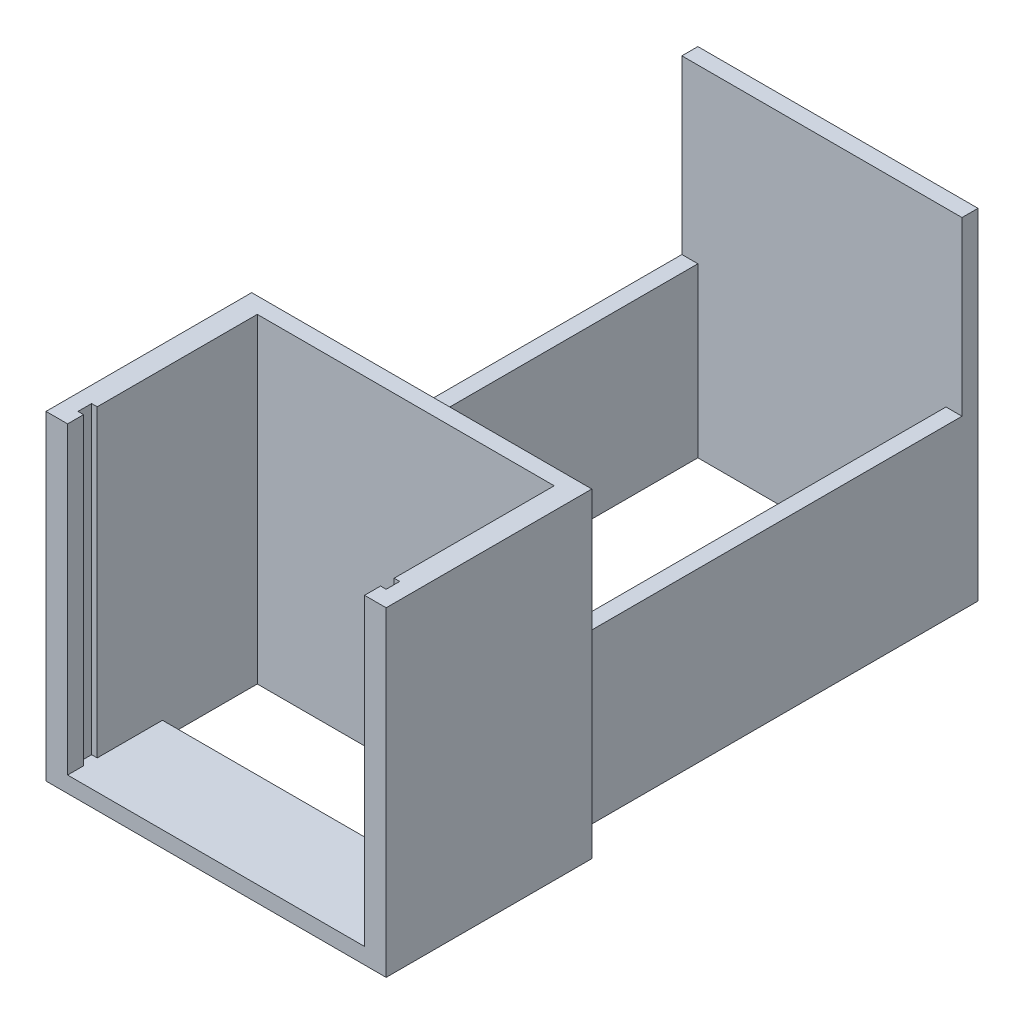
ISO-10303-21;
HEADER;
FILE_DESCRIPTION(('STEP AP214'),'2;1');
FILE_NAME('part.step','',(''),(''),'','','');
FILE_SCHEMA(('AUTOMOTIVE_DESIGN { 1 0 10303 214 1 1 1 1 }'));
ENDSEC;
DATA;
#1=APPLICATION_CONTEXT('core data for automotive mechanical design processes');
#2=APPLICATION_PROTOCOL_DEFINITION('international standard','automotive_design',2000,#1);
#3=PRODUCT_CONTEXT('',#1,'mechanical');
#4=PRODUCT('Part','Part','',(#3));
#5=PRODUCT_RELATED_PRODUCT_CATEGORY('part','',(#4));
#6=PRODUCT_DEFINITION_FORMATION('','',#4);
#7=PRODUCT_DEFINITION_CONTEXT('part definition',#1,'design');
#8=PRODUCT_DEFINITION('design','',#6,#7);
#9=PRODUCT_DEFINITION_SHAPE('','',#8);
#10=(LENGTH_UNIT() NAMED_UNIT(*) SI_UNIT(.MILLI.,.METRE.));
#11=(NAMED_UNIT(*) PLANE_ANGLE_UNIT() SI_UNIT($,.RADIAN.));
#12=(NAMED_UNIT(*) SI_UNIT($,.STERADIAN.) SOLID_ANGLE_UNIT());
#13=UNCERTAINTY_MEASURE_WITH_UNIT(LENGTH_MEASURE(1.E-05),#10,'distance_accuracy_value','');
#14=(GEOMETRIC_REPRESENTATION_CONTEXT(3) GLOBAL_UNCERTAINTY_ASSIGNED_CONTEXT((#13)) GLOBAL_UNIT_ASSIGNED_CONTEXT((#10,
#11,#12)) REPRESENTATION_CONTEXT('',''));
#15=CARTESIAN_POINT('',(0.,0.,0.));
#16=DIRECTION('',(0.,0.,1.));
#17=DIRECTION('',(1.,0.,0.));
#18=AXIS2_PLACEMENT_3D('',#15,#16,#17);
#19=CARTESIAN_POINT('',(0.,0.,2.39346473029046));
#20=DIRECTION('',(0.,0.,-1.));
#21=DIRECTION('',(-1.,0.,0.));
#22=AXIS2_PLACEMENT_3D('',#19,#20,#21);
#23=PLANE('',#22);
#24=DIRECTION('',(0.,-1.,0.));
#25=VECTOR('',#24,1.);
#26=CARTESIAN_POINT('',(-61.1489834024897,0.,2.39346473029046));
#27=LINE('',#26,#25);
#28=CARTESIAN_POINT('',(-61.1489834024897,19.,2.39346473029046));
#29=VERTEX_POINT('',#28);
#30=CARTESIAN_POINT('',(-61.1489834024897,-2.,2.39346473029046));
#31=VERTEX_POINT('',#30);
#32=EDGE_CURVE('E259',#29,#31,#27,.T.);
#33=ORIENTED_EDGE('',*,*,#32,.T.);
#34=DIRECTION('',(-1.,0.,0.));
#35=VECTOR('',#34,1.);
#36=CARTESIAN_POINT('',(-22.3989834024897,-2.,2.39346473029046));
#37=LINE('',#36,#35);
#38=CARTESIAN_POINT('',(-64.8989834024897,-2.,2.39346473029046));
#39=VERTEX_POINT('',#38);
#40=EDGE_CURVE('E327',#31,#39,#37,.T.);
#41=ORIENTED_EDGE('',*,*,#40,.T.);
#42=DIRECTION('',(0.,1.,0.));
#43=VECTOR('',#42,1.);
#44=CARTESIAN_POINT('',(-64.8989834024897,38.,2.39346473029046));
#45=LINE('',#44,#43);
#46=CARTESIAN_POINT('',(-64.8989834024897,38.,2.39346473029046));
#47=VERTEX_POINT('',#46);
#48=EDGE_CURVE('E331',#39,#47,#45,.T.);
#49=ORIENTED_EDGE('',*,*,#48,.T.);
#50=DIRECTION('',(1.,0.,0.));
#51=VECTOR('',#50,1.);
#52=CARTESIAN_POINT('',(-22.3989834024897,38.,2.39346473029046));
#53=LINE('',#52,#51);
#54=CARTESIAN_POINT('',(-22.3989834024897,38.,2.39346473029046));
#55=VERTEX_POINT('',#54);
#56=EDGE_CURVE('E335',#47,#55,#53,.T.);
#57=ORIENTED_EDGE('',*,*,#56,.T.);
#58=DIRECTION('',(0.,-1.,0.));
#59=VECTOR('',#58,1.);
#60=CARTESIAN_POINT('',(-22.3989834024897,38.,2.39346473029046));
#61=LINE('',#60,#59);
#62=CARTESIAN_POINT('',(-22.3989834024897,-2.,2.39346473029046));
#63=VERTEX_POINT('',#62);
#64=EDGE_CURVE('E324',#55,#63,#61,.T.);
#65=ORIENTED_EDGE('',*,*,#64,.T.);
#66=CARTESIAN_POINT('',(-26.1489834024897,-2.,2.39346473029046));
#67=VERTEX_POINT('',#66);
#68=EDGE_CURVE('E328',#63,#67,#37,.T.);
#69=ORIENTED_EDGE('',*,*,#68,.T.);
#70=DIRECTION('',(0.,-1.,0.));
#71=VECTOR('',#70,1.);
#72=CARTESIAN_POINT('',(-26.1489834024897,0.,2.39346473029046));
#73=LINE('',#72,#71);
#74=CARTESIAN_POINT('',(-26.1489834024897,19.,2.39346473029046));
#75=VERTEX_POINT('',#74);
#76=EDGE_CURVE('E286',#75,#67,#73,.T.);
#77=ORIENTED_EDGE('',*,*,#76,.F.);
#78=DIRECTION('',(-1.,0.,0.));
#79=VECTOR('',#78,1.);
#80=CARTESIAN_POINT('',(0.,19.,2.39346473029046));
#81=LINE('',#80,#79);
#82=CARTESIAN_POINT('',(-28.1489834024897,19.,2.39346473029046));
#83=VERTEX_POINT('',#82);
#84=EDGE_CURVE('E291',#75,#83,#81,.T.);
#85=ORIENTED_EDGE('',*,*,#84,.T.);
#86=DIRECTION('',(0.,-1.,0.));
#87=VECTOR('',#86,1.);
#88=CARTESIAN_POINT('',(-28.1489834024897,0.,2.39346473029046));
#89=LINE('',#88,#87);
#90=CARTESIAN_POINT('',(-28.1489834024897,-2.,2.39346473029046));
#91=VERTEX_POINT('',#90);
#92=EDGE_CURVE('E283',#83,#91,#89,.T.);
#93=ORIENTED_EDGE('',*,*,#92,.T.);
#94=CARTESIAN_POINT('',(-59.1489834024897,-2.,2.39346473029046));
#95=VERTEX_POINT('',#94);
#96=EDGE_CURVE('E332',#91,#95,#37,.T.);
#97=ORIENTED_EDGE('',*,*,#96,.T.);
#98=DIRECTION('',(0.,-1.,0.));
#99=VECTOR('',#98,1.);
#100=CARTESIAN_POINT('',(-59.1489834024897,0.,2.39346473029046));
#101=LINE('',#100,#99);
#102=CARTESIAN_POINT('',(-59.1489834024897,19.,2.39346473029046));
#103=VERTEX_POINT('',#102);
#104=EDGE_CURVE('E57',#103,#95,#101,.T.);
#105=ORIENTED_EDGE('',*,*,#104,.F.);
#106=DIRECTION('',(-1.,0.,0.));
#107=VECTOR('',#106,1.);
#108=CARTESIAN_POINT('',(0.,18.9999999999999,2.39346473029046));
#109=LINE('',#108,#107);
#110=EDGE_CURVE('E52',#103,#29,#109,.T.);
#111=ORIENTED_EDGE('',*,*,#110,.T.);
#112=EDGE_LOOP('',(#33,#41,#49,#57,#65,#69,#77,#85,#93,#97,#105,#111));
#113=FACE_BOUND('',#112,.T.);
#114=ADVANCED_FACE('F37',(#113),#23,.T.);
#115=CARTESIAN_POINT('',(0.,0.,0.));
#116=DIRECTION('',(0.,-1.,0.));
#117=DIRECTION('',(0.,0.,-1.));
#118=AXIS2_PLACEMENT_3D('',#115,#116,#117);
#119=PLANE('',#118);
#120=DIRECTION('',(0.,0.,1.));
#121=VECTOR('',#120,1.);
#122=CARTESIAN_POINT('',(-25.0989834024897,0.,0.));
#123=LINE('',#122,#121);
#124=CARTESIAN_POINT('',(-25.0989834024897,0.,16.2434647302905));
#125=VERTEX_POINT('',#124);
#126=CARTESIAN_POINT('',(-25.0989834024897,0.,24.3934647302905));
#127=VERTEX_POINT('',#126);
#128=EDGE_CURVE('E345',#125,#127,#123,.T.);
#129=ORIENTED_EDGE('',*,*,#128,.F.);
#130=DIRECTION('',(1.,0.,0.));
#131=VECTOR('',#130,1.);
#132=CARTESIAN_POINT('',(0.,0.,16.2434647302905));
#133=LINE('',#132,#131);
#134=CARTESIAN_POINT('',(-62.1989834024897,0.,16.2434647302905));
#135=VERTEX_POINT('',#134);
#136=EDGE_CURVE('E304',#135,#125,#133,.T.);
#137=ORIENTED_EDGE('',*,*,#136,.F.);
#138=DIRECTION('',(0.,0.,1.));
#139=VECTOR('',#138,1.);
#140=CARTESIAN_POINT('',(-62.1989834024897,0.,0.));
#141=LINE('',#140,#139);
#142=CARTESIAN_POINT('',(-62.1989834024897,0.,24.3934647302905));
#143=VERTEX_POINT('',#142);
#144=EDGE_CURVE('E404',#135,#143,#141,.T.);
#145=ORIENTED_EDGE('',*,*,#144,.T.);
#146=DIRECTION('',(1.,0.,0.));
#147=VECTOR('',#146,1.);
#148=CARTESIAN_POINT('',(0.,0.,24.3934647302905));
#149=LINE('',#148,#147);
#150=CARTESIAN_POINT('',(-62.8989834024897,0.,24.3934647302905));
#151=VERTEX_POINT('',#150);
#152=EDGE_CURVE('E426',#151,#143,#149,.T.);
#153=ORIENTED_EDGE('',*,*,#152,.F.);
#154=DIRECTION('',(0.,0.,1.));
#155=VECTOR('',#154,1.);
#156=CARTESIAN_POINT('',(-62.8989834024897,0.,0.));
#157=LINE('',#156,#155);
#158=CARTESIAN_POINT('',(-62.8989834024897,0.,26.0934647302905));
#159=VERTEX_POINT('',#158);
#160=EDGE_CURVE('E423',#151,#159,#157,.T.);
#161=ORIENTED_EDGE('',*,*,#160,.T.);
#162=DIRECTION('',(1.,0.,0.));
#163=VECTOR('',#162,1.);
#164=CARTESIAN_POINT('',(0.,0.,26.0934647302905));
#165=LINE('',#164,#163);
#166=CARTESIAN_POINT('',(-62.1989834024897,0.,26.0934647302905));
#167=VERTEX_POINT('',#166);
#168=EDGE_CURVE('E420',#159,#167,#165,.T.);
#169=ORIENTED_EDGE('',*,*,#168,.T.);
#170=CARTESIAN_POINT('',(-62.1989834024897,0.,28.0934647302905));
#171=VERTEX_POINT('',#170);
#172=EDGE_CURVE('E399',#167,#171,#141,.T.);
#173=ORIENTED_EDGE('',*,*,#172,.T.);
#174=DIRECTION('',(1.,0.,0.));
#175=VECTOR('',#174,1.);
#176=CARTESIAN_POINT('',(-64.8989834024897,0.,28.0934647302905));
#177=LINE('',#176,#175);
#178=CARTESIAN_POINT('',(-25.0989834024897,0.,28.0934647302905));
#179=VERTEX_POINT('',#178);
#180=EDGE_CURVE('E387',#171,#179,#177,.T.);
#181=ORIENTED_EDGE('',*,*,#180,.T.);
#182=CARTESIAN_POINT('',(-25.0989834024897,0.,26.0934647302905));
#183=VERTEX_POINT('',#182);
#184=EDGE_CURVE('E350',#183,#179,#123,.T.);
#185=ORIENTED_EDGE('',*,*,#184,.F.);
#186=DIRECTION('',(1.,0.,0.));
#187=VECTOR('',#186,1.);
#188=CARTESIAN_POINT('',(0.,0.,26.0934647302905));
#189=LINE('',#188,#187);
#190=CARTESIAN_POINT('',(-24.3989834024897,0.,26.0934647302905));
#191=VERTEX_POINT('',#190);
#192=EDGE_CURVE('E371',#183,#191,#189,.T.);
#193=ORIENTED_EDGE('',*,*,#192,.T.);
#194=DIRECTION('',(0.,0.,1.));
#195=VECTOR('',#194,1.);
#196=CARTESIAN_POINT('',(-24.3989834024897,0.,0.));
#197=LINE('',#196,#195);
#198=CARTESIAN_POINT('',(-24.3989834024897,0.,24.3934647302905));
#199=VERTEX_POINT('',#198);
#200=EDGE_CURVE('E368',#199,#191,#197,.T.);
#201=ORIENTED_EDGE('',*,*,#200,.F.);
#202=DIRECTION('',(1.,0.,0.));
#203=VECTOR('',#202,1.);
#204=CARTESIAN_POINT('',(0.,0.,24.3934647302905));
#205=LINE('',#204,#203);
#206=EDGE_CURVE('E365',#127,#199,#205,.T.);
#207=ORIENTED_EDGE('',*,*,#206,.F.);
#208=EDGE_LOOP('',(#129,#137,#145,#153,#161,#169,#173,#181,#185,#193,#201,#207));
#209=FACE_BOUND('',#208,.T.);
#210=ADVANCED_FACE('F446',(#209),#119,.F.);
#211=CARTESIAN_POINT('',(-64.8989834024897,38.,0.));
#212=DIRECTION('',(1.,0.,0.));
#213=DIRECTION('',(0.,0.,-1.));
#214=AXIS2_PLACEMENT_3D('',#211,#212,#213);
#215=PLANE('',#214);
#216=DIRECTION('',(0.,0.,1.));
#217=VECTOR('',#216,1.);
#218=CARTESIAN_POINT('',(-64.8989834024897,38.,0.));
#219=LINE('',#218,#217);
#220=CARTESIAN_POINT('',(-64.8989834024897,38.,28.0934647302905));
#221=VERTEX_POINT('',#220);
#222=EDGE_CURVE('E400',#47,#221,#219,.T.);
#223=ORIENTED_EDGE('',*,*,#222,.F.);
#224=ORIENTED_EDGE('',*,*,#48,.F.);
#225=DIRECTION('',(0.,0.,1.));
#226=VECTOR('',#225,1.);
#227=CARTESIAN_POINT('',(-64.8989834024897,-2.,28.0934647302905));
#228=LINE('',#227,#226);
#229=CARTESIAN_POINT('',(-64.8989834024897,-2.,28.0934647302905));
#230=VERTEX_POINT('',#229);
#231=EDGE_CURVE('E388',#39,#230,#228,.T.);
#232=ORIENTED_EDGE('',*,*,#231,.T.);
#233=DIRECTION('',(0.,-1.,0.));
#234=VECTOR('',#233,1.);
#235=CARTESIAN_POINT('',(-64.8989834024897,38.,28.0934647302905));
#236=LINE('',#235,#234);
#237=EDGE_CURVE('E11',#221,#230,#236,.T.);
#238=ORIENTED_EDGE('',*,*,#237,.F.);
#239=EDGE_LOOP('',(#223,#224,#232,#238));
#240=FACE_BOUND('',#239,.T.);
#241=ADVANCED_FACE('F39',(#240),#215,.F.);
#242=CARTESIAN_POINT('',(0.,38.,28.0934647302905));
#243=DIRECTION('',(0.,0.,-1.));
#244=DIRECTION('',(-1.,0.,0.));
#245=AXIS2_PLACEMENT_3D('',#242,#243,#244);
#246=PLANE('',#245);
#247=ORIENTED_EDGE('',*,*,#237,.T.);
#248=DIRECTION('',(1.,0.,0.));
#249=VECTOR('',#248,1.);
#250=CARTESIAN_POINT('',(-64.8989834024897,-2.,28.0934647302905));
#251=LINE('',#250,#249);
#252=CARTESIAN_POINT('',(-22.3989834024897,-2.,28.0934647302905));
#253=VERTEX_POINT('',#252);
#254=EDGE_CURVE('E391',#230,#253,#251,.T.);
#255=ORIENTED_EDGE('',*,*,#254,.T.);
#256=DIRECTION('',(0.,1.,0.));
#257=VECTOR('',#256,1.);
#258=CARTESIAN_POINT('',(-22.3989834024897,-2.,28.0934647302905));
#259=LINE('',#258,#257);
#260=CARTESIAN_POINT('',(-22.3989834024897,38.,28.0934647302905));
#261=VERTEX_POINT('',#260);
#262=EDGE_CURVE('E396',#253,#261,#259,.T.);
#263=ORIENTED_EDGE('',*,*,#262,.T.);
#264=DIRECTION('',(1.,0.,0.));
#265=VECTOR('',#264,1.);
#266=CARTESIAN_POINT('',(0.,38.,28.0934647302905));
#267=LINE('',#266,#265);
#268=CARTESIAN_POINT('',(-25.0989834024897,38.,28.0934647302905));
#269=VERTEX_POINT('',#268);
#270=EDGE_CURVE('E360',#269,#261,#267,.T.);
#271=ORIENTED_EDGE('',*,*,#270,.F.);
#272=DIRECTION('',(0.,-1.,0.));
#273=VECTOR('',#272,1.);
#274=CARTESIAN_POINT('',(-25.0989834024897,38.,28.0934647302905));
#275=LINE('',#274,#273);
#276=EDGE_CURVE('E363',#269,#179,#275,.T.);
#277=ORIENTED_EDGE('',*,*,#276,.T.);
#278=ORIENTED_EDGE('',*,*,#180,.F.);
#279=DIRECTION('',(0.,-1.,0.));
#280=VECTOR('',#279,1.);
#281=CARTESIAN_POINT('',(-62.1989834024897,38.,28.0934647302905));
#282=LINE('',#281,#280);
#283=CARTESIAN_POINT('',(-62.1989834024897,38.,28.0934647302905));
#284=VERTEX_POINT('',#283);
#285=EDGE_CURVE('E45',#284,#171,#282,.T.);
#286=ORIENTED_EDGE('',*,*,#285,.F.);
#287=DIRECTION('',(1.,0.,0.));
#288=VECTOR('',#287,1.);
#289=CARTESIAN_POINT('',(0.,38.,28.0934647302905));
#290=LINE('',#289,#288);
#291=EDGE_CURVE('E403',#221,#284,#290,.T.);
#292=ORIENTED_EDGE('',*,*,#291,.F.);
#293=EDGE_LOOP('',(#247,#255,#263,#271,#277,#278,#286,#292));
#294=FACE_BOUND('',#293,.T.);
#295=ADVANCED_FACE('F449',(#294),#246,.F.);
#296=CARTESIAN_POINT('',(-62.1989834024897,38.,0.));
#297=DIRECTION('',(1.,0.,0.));
#298=DIRECTION('',(0.,0.,-1.));
#299=AXIS2_PLACEMENT_3D('',#296,#297,#298);
#300=PLANE('',#299);
#301=ORIENTED_EDGE('',*,*,#172,.F.);
#302=DIRECTION('',(0.,-1.,0.));
#303=VECTOR('',#302,1.);
#304=CARTESIAN_POINT('',(-62.1989834024897,38.,26.0934647302905));
#305=LINE('',#304,#303);
#306=CARTESIAN_POINT('',(-62.1989834024897,38.,26.0934647302905));
#307=VERTEX_POINT('',#306);
#308=EDGE_CURVE('E436',#307,#167,#305,.T.);
#309=ORIENTED_EDGE('',*,*,#308,.F.);
#310=DIRECTION('',(0.,0.,1.));
#311=VECTOR('',#310,1.);
#312=CARTESIAN_POINT('',(-62.1989834024897,38.,0.));
#313=LINE('',#312,#311);
#314=EDGE_CURVE('E406',#307,#284,#313,.T.);
#315=ORIENTED_EDGE('',*,*,#314,.T.);
#316=ORIENTED_EDGE('',*,*,#285,.T.);
#317=EDGE_LOOP('',(#301,#309,#315,#316));
#318=FACE_BOUND('',#317,.T.);
#319=ADVANCED_FACE('F440',(#318),#300,.T.);
#320=CARTESIAN_POINT('',(0.,38.,26.0934647302905));
#321=DIRECTION('',(0.,0.,-1.));
#322=DIRECTION('',(-1.,0.,0.));
#323=AXIS2_PLACEMENT_3D('',#320,#321,#322);
#324=PLANE('',#323);
#325=ORIENTED_EDGE('',*,*,#168,.F.);
#326=DIRECTION('',(0.,-1.,0.));
#327=VECTOR('',#326,1.);
#328=CARTESIAN_POINT('',(-62.8989834024897,38.,26.0934647302905));
#329=LINE('',#328,#327);
#330=CARTESIAN_POINT('',(-62.8989834024897,38.,26.0934647302905));
#331=VERTEX_POINT('',#330);
#332=EDGE_CURVE('E434',#331,#159,#329,.T.);
#333=ORIENTED_EDGE('',*,*,#332,.F.);
#334=DIRECTION('',(1.,0.,0.));
#335=VECTOR('',#334,1.);
#336=CARTESIAN_POINT('',(0.,38.,26.0934647302905));
#337=LINE('',#336,#335);
#338=EDGE_CURVE('E409',#331,#307,#337,.T.);
#339=ORIENTED_EDGE('',*,*,#338,.T.);
#340=ORIENTED_EDGE('',*,*,#308,.T.);
#341=EDGE_LOOP('',(#325,#333,#339,#340));
#342=FACE_BOUND('',#341,.T.);
#343=ADVANCED_FACE('F493',(#342),#324,.T.);
#344=CARTESIAN_POINT('',(-62.8989834024897,38.,0.));
#345=DIRECTION('',(1.,0.,0.));
#346=DIRECTION('',(0.,0.,-1.));
#347=AXIS2_PLACEMENT_3D('',#344,#345,#346);
#348=PLANE('',#347);
#349=ORIENTED_EDGE('',*,*,#160,.F.);
#350=DIRECTION('',(0.,-1.,0.));
#351=VECTOR('',#350,1.);
#352=CARTESIAN_POINT('',(-62.8989834024897,38.,24.3934647302905));
#353=LINE('',#352,#351);
#354=CARTESIAN_POINT('',(-62.8989834024897,38.,24.3934647302905));
#355=VERTEX_POINT('',#354);
#356=EDGE_CURVE('E432',#355,#151,#353,.T.);
#357=ORIENTED_EDGE('',*,*,#356,.F.);
#358=DIRECTION('',(0.,0.,1.));
#359=VECTOR('',#358,1.);
#360=CARTESIAN_POINT('',(-62.8989834024897,38.,0.));
#361=LINE('',#360,#359);
#362=EDGE_CURVE('E413',#355,#331,#361,.T.);
#363=ORIENTED_EDGE('',*,*,#362,.T.);
#364=ORIENTED_EDGE('',*,*,#332,.T.);
#365=EDGE_LOOP('',(#349,#357,#363,#364));
#366=FACE_BOUND('',#365,.T.);
#367=ADVANCED_FACE('F490',(#366),#348,.T.);
#368=CARTESIAN_POINT('',(0.,38.,24.3934647302905));
#369=DIRECTION('',(0.,0.,-1.));
#370=DIRECTION('',(-1.,0.,0.));
#371=AXIS2_PLACEMENT_3D('',#368,#369,#370);
#372=PLANE('',#371);
#373=ORIENTED_EDGE('',*,*,#152,.T.);
#374=DIRECTION('',(0.,-1.,0.));
#375=VECTOR('',#374,1.);
#376=CARTESIAN_POINT('',(-62.1989834024897,38.,24.3934647302905));
#377=LINE('',#376,#375);
#378=CARTESIAN_POINT('',(-62.1989834024897,38.,24.3934647302905));
#379=VERTEX_POINT('',#378);
#380=EDGE_CURVE('E429',#379,#143,#377,.T.);
#381=ORIENTED_EDGE('',*,*,#380,.F.);
#382=DIRECTION('',(1.,0.,0.));
#383=VECTOR('',#382,1.);
#384=CARTESIAN_POINT('',(0.,38.,24.3934647302905));
#385=LINE('',#384,#383);
#386=EDGE_CURVE('E416',#355,#379,#385,.T.);
#387=ORIENTED_EDGE('',*,*,#386,.F.);
#388=ORIENTED_EDGE('',*,*,#356,.T.);
#389=EDGE_LOOP('',(#373,#381,#387,#388));
#390=FACE_BOUND('',#389,.T.);
#391=ADVANCED_FACE('F486',(#390),#372,.F.);
#392=ORIENTED_EDGE('',*,*,#144,.F.);
#393=DIRECTION('',(0.,1.,0.));
#394=VECTOR('',#393,1.);
#395=CARTESIAN_POINT('',(-62.1989834024897,-2.,16.2434647302905));
#396=LINE('',#395,#394);
#397=CARTESIAN_POINT('',(-62.1989834024897,-2.,16.2434647302905));
#398=VERTEX_POINT('',#397);
#399=EDGE_CURVE('E317',#398,#135,#396,.T.);
#400=ORIENTED_EDGE('',*,*,#399,.F.);
#401=DIRECTION('',(0.,0.,1.));
#402=VECTOR('',#401,1.);
#403=CARTESIAN_POINT('',(-62.1989834024897,-2.,0.));
#404=LINE('',#403,#402);
#405=CARTESIAN_POINT('',(-62.1989834024897,-2.,4.39346473029046));
#406=VERTEX_POINT('',#405);
#407=EDGE_CURVE('E305',#406,#398,#404,.T.);
#408=ORIENTED_EDGE('',*,*,#407,.F.);
#409=DIRECTION('',(0.,-1.,0.));
#410=VECTOR('',#409,1.);
#411=CARTESIAN_POINT('',(-62.1989834024897,0.,4.39346473029046));
#412=LINE('',#411,#410);
#413=CARTESIAN_POINT('',(-62.1989834024897,38.,4.39346473029046));
#414=VERTEX_POINT('',#413);
#415=EDGE_CURVE('E338',#414,#406,#412,.T.);
#416=ORIENTED_EDGE('',*,*,#415,.F.);
#417=EDGE_CURVE('E410',#414,#379,#313,.T.);
#418=ORIENTED_EDGE('',*,*,#417,.T.);
#419=ORIENTED_EDGE('',*,*,#380,.T.);
#420=EDGE_LOOP('',(#392,#400,#408,#416,#418,#419));
#421=FACE_BOUND('',#420,.T.);
#422=ADVANCED_FACE('F479',(#421),#300,.T.);
#423=CARTESIAN_POINT('',(0.,38.,0.));
#424=DIRECTION('',(0.,1.,0.));
#425=DIRECTION('',(0.,0.,1.));
#426=AXIS2_PLACEMENT_3D('',#423,#424,#425);
#427=PLANE('',#426);
#428=ORIENTED_EDGE('',*,*,#222,.T.);
#429=ORIENTED_EDGE('',*,*,#291,.T.);
#430=ORIENTED_EDGE('',*,*,#314,.F.);
#431=ORIENTED_EDGE('',*,*,#338,.F.);
#432=ORIENTED_EDGE('',*,*,#362,.F.);
#433=ORIENTED_EDGE('',*,*,#386,.T.);
#434=ORIENTED_EDGE('',*,*,#417,.F.);
#435=DIRECTION('',(1.,0.,0.));
#436=VECTOR('',#435,1.);
#437=CARTESIAN_POINT('',(-22.3989834024897,38.,4.39346473029046));
#438=LINE('',#437,#436);
#439=CARTESIAN_POINT('',(-25.0989834024897,38.,4.39346473029046));
#440=VERTEX_POINT('',#439);
#441=EDGE_CURVE('E322',#414,#440,#438,.T.);
#442=ORIENTED_EDGE('',*,*,#441,.T.);
#443=DIRECTION('',(0.,0.,1.));
#444=VECTOR('',#443,1.);
#445=CARTESIAN_POINT('',(-25.0989834024897,38.,0.));
#446=LINE('',#445,#444);
#447=CARTESIAN_POINT('',(-25.0989834024897,38.,24.3934647302905));
#448=VERTEX_POINT('',#447);
#449=EDGE_CURVE('E349',#440,#448,#446,.T.);
#450=ORIENTED_EDGE('',*,*,#449,.T.);
#451=DIRECTION('',(1.,0.,0.));
#452=VECTOR('',#451,1.);
#453=CARTESIAN_POINT('',(0.,38.,24.3934647302905));
#454=LINE('',#453,#452);
#455=CARTESIAN_POINT('',(-24.3989834024897,38.,24.3934647302905));
#456=VERTEX_POINT('',#455);
#457=EDGE_CURVE('E352',#448,#456,#454,.T.);
#458=ORIENTED_EDGE('',*,*,#457,.T.);
#459=DIRECTION('',(0.,0.,1.));
#460=VECTOR('',#459,1.);
#461=CARTESIAN_POINT('',(-24.3989834024897,38.,0.));
#462=LINE('',#461,#460);
#463=CARTESIAN_POINT('',(-24.3989834024897,38.,26.0934647302905));
#464=VERTEX_POINT('',#463);
#465=EDGE_CURVE('E355',#456,#464,#462,.T.);
#466=ORIENTED_EDGE('',*,*,#465,.T.);
#467=DIRECTION('',(1.,0.,0.));
#468=VECTOR('',#467,1.);
#469=CARTESIAN_POINT('',(0.,38.,26.0934647302905));
#470=LINE('',#469,#468);
#471=CARTESIAN_POINT('',(-25.0989834024897,38.,26.0934647302905));
#472=VERTEX_POINT('',#471);
#473=EDGE_CURVE('E357',#472,#464,#470,.T.);
#474=ORIENTED_EDGE('',*,*,#473,.F.);
#475=EDGE_CURVE('E353',#472,#269,#446,.T.);
#476=ORIENTED_EDGE('',*,*,#475,.T.);
#477=ORIENTED_EDGE('',*,*,#270,.T.);
#478=DIRECTION('',(0.,0.,1.));
#479=VECTOR('',#478,1.);
#480=CARTESIAN_POINT('',(-22.3989834024897,38.,0.));
#481=LINE('',#480,#479);
#482=EDGE_CURVE('E346',#55,#261,#481,.T.);
#483=ORIENTED_EDGE('',*,*,#482,.F.);
#484=ORIENTED_EDGE('',*,*,#56,.F.);
#485=EDGE_LOOP('',(#428,#429,#430,#431,#432,#433,#434,#442,#450,#458,#466,#474,#476,#477,#483,#484));
#486=FACE_BOUND('',#485,.T.);
#487=ADVANCED_FACE('F495',(#486),#427,.T.);
#488=CARTESIAN_POINT('',(-22.3989834024897,-2.,28.0934647302905));
#489=DIRECTION('',(1.,0.,0.));
#490=DIRECTION('',(0.,0.,-1.));
#491=AXIS2_PLACEMENT_3D('',#488,#489,#490);
#492=PLANE('',#491);
#493=DIRECTION('',(0.,0.,-1.));
#494=VECTOR('',#493,1.);
#495=CARTESIAN_POINT('',(-22.3989834024897,-2.,28.0934647302905));
#496=LINE('',#495,#494);
#497=EDGE_CURVE('E394',#253,#63,#496,.T.);
#498=ORIENTED_EDGE('',*,*,#497,.T.);
#499=ORIENTED_EDGE('',*,*,#64,.F.);
#500=ORIENTED_EDGE('',*,*,#482,.T.);
#501=ORIENTED_EDGE('',*,*,#262,.F.);
#502=EDGE_LOOP('',(#498,#499,#500,#501));
#503=FACE_BOUND('',#502,.T.);
#504=ADVANCED_FACE('F508',(#503),#492,.T.);
#505=CARTESIAN_POINT('',(0.,-2.,0.));
#506=DIRECTION('',(0.,-1.,0.));
#507=DIRECTION('',(0.,0.,-1.));
#508=AXIS2_PLACEMENT_3D('',#505,#506,#507);
#509=PLANE('',#508);
#510=DIRECTION('',(0.,0.,1.));
#511=VECTOR('',#510,1.);
#512=CARTESIAN_POINT('',(-28.1489834024897,-2.,-47.6065352697095));
#513=LINE('',#512,#511);
#514=CARTESIAN_POINT('',(-28.1489834024897,-2.,-47.6065352697095));
#515=VERTEX_POINT('',#514);
#516=EDGE_CURVE('E288',#515,#91,#513,.T.);
#517=ORIENTED_EDGE('',*,*,#516,.F.);
#518=DIRECTION('',(1.,0.,0.));
#519=VECTOR('',#518,1.);
#520=CARTESIAN_POINT('',(0.,-2.,-47.6065352697095));
#521=LINE('',#520,#519);
#522=CARTESIAN_POINT('',(-59.1489834024897,-2.,-47.6065352697095));
#523=VERTEX_POINT('',#522);
#524=EDGE_CURVE('E251',#523,#515,#521,.T.);
#525=ORIENTED_EDGE('',*,*,#524,.F.);
#526=DIRECTION('',(0.,0.,1.));
#527=VECTOR('',#526,1.);
#528=CARTESIAN_POINT('',(-59.1489834024897,-2.,-47.6065352697095));
#529=LINE('',#528,#527);
#530=EDGE_CURVE('E276',#523,#95,#529,.T.);
#531=ORIENTED_EDGE('',*,*,#530,.T.);
#532=ORIENTED_EDGE('',*,*,#96,.F.);
#533=EDGE_LOOP('',(#517,#525,#531,#532));
#534=FACE_BOUND('',#533,.T.);
#535=ORIENTED_EDGE('',*,*,#407,.T.);
#536=DIRECTION('',(1.,0.,0.));
#537=VECTOR('',#536,1.);
#538=CARTESIAN_POINT('',(0.,-2.,16.2434647302905));
#539=LINE('',#538,#537);
#540=CARTESIAN_POINT('',(-25.0989834024897,-2.,16.2434647302905));
#541=VERTEX_POINT('',#540);
#542=EDGE_CURVE('E308',#398,#541,#539,.T.);
#543=ORIENTED_EDGE('',*,*,#542,.T.);
#544=DIRECTION('',(0.,0.,-1.));
#545=VECTOR('',#544,1.);
#546=CARTESIAN_POINT('',(-25.0989834024897,-2.,0.));
#547=LINE('',#546,#545);
#548=CARTESIAN_POINT('',(-25.0989834024897,-2.,4.39346473029046));
#549=VERTEX_POINT('',#548);
#550=EDGE_CURVE('E311',#541,#549,#547,.T.);
#551=ORIENTED_EDGE('',*,*,#550,.T.);
#552=DIRECTION('',(-1.,0.,0.));
#553=VECTOR('',#552,1.);
#554=CARTESIAN_POINT('',(0.,-2.,4.39346473029046));
#555=LINE('',#554,#553);
#556=EDGE_CURVE('E314',#549,#406,#555,.T.);
#557=ORIENTED_EDGE('',*,*,#556,.T.);
#558=EDGE_LOOP('',(#535,#543,#551,#557));
#559=FACE_BOUND('',#558,.T.);
#560=ORIENTED_EDGE('',*,*,#231,.F.);
#561=ORIENTED_EDGE('',*,*,#40,.F.);
#562=DIRECTION('',(0.,0.,1.));
#563=VECTOR('',#562,1.);
#564=CARTESIAN_POINT('',(-61.1489834024897,-2.,-47.6065352697095));
#565=LINE('',#564,#563);
#566=CARTESIAN_POINT('',(-61.1489834024897,-2.,-49.6065352697095));
#567=VERTEX_POINT('',#566);
#568=EDGE_CURVE('E270',#567,#31,#565,.T.);
#569=ORIENTED_EDGE('',*,*,#568,.F.);
#570=DIRECTION('',(1.,0.,0.));
#571=VECTOR('',#570,1.);
#572=CARTESIAN_POINT('',(0.,-2.,-49.6065352697095));
#573=LINE('',#572,#571);
#574=CARTESIAN_POINT('',(-26.1489834024897,-2.,-49.6065352697095));
#575=VERTEX_POINT('',#574);
#576=EDGE_CURVE('E248',#567,#575,#573,.T.);
#577=ORIENTED_EDGE('',*,*,#576,.T.);
#578=DIRECTION('',(0.,0.,1.));
#579=VECTOR('',#578,1.);
#580=CARTESIAN_POINT('',(-26.1489834024897,-2.,-47.6065352697095));
#581=LINE('',#580,#579);
#582=EDGE_CURVE('E296',#575,#67,#581,.T.);
#583=ORIENTED_EDGE('',*,*,#582,.T.);
#584=ORIENTED_EDGE('',*,*,#68,.F.);
#585=ORIENTED_EDGE('',*,*,#497,.F.);
#586=ORIENTED_EDGE('',*,*,#254,.F.);
#587=EDGE_LOOP('',(#560,#561,#569,#577,#583,#584,#585,#586));
#588=FACE_BOUND('',#587,.T.);
#589=ADVANCED_FACE('F503',(#534,#559,#588),#509,.T.);
#590=CARTESIAN_POINT('',(-25.0989834024897,38.,0.));
#591=DIRECTION('',(1.,0.,0.));
#592=DIRECTION('',(0.,0.,-1.));
#593=AXIS2_PLACEMENT_3D('',#590,#591,#592);
#594=PLANE('',#593);
#595=DIRECTION('',(0.,1.,0.));
#596=VECTOR('',#595,1.);
#597=CARTESIAN_POINT('',(-25.0989834024897,0.,4.39346473029046));
#598=LINE('',#597,#596);
#599=EDGE_CURVE('E342',#549,#440,#598,.T.);
#600=ORIENTED_EDGE('',*,*,#599,.F.);
#601=ORIENTED_EDGE('',*,*,#550,.F.);
#602=DIRECTION('',(0.,1.,0.));
#603=VECTOR('',#602,1.);
#604=CARTESIAN_POINT('',(-25.0989834024897,-2.,16.2434647302905));
#605=LINE('',#604,#603);
#606=EDGE_CURVE('E320',#541,#125,#605,.T.);
#607=ORIENTED_EDGE('',*,*,#606,.T.);
#608=ORIENTED_EDGE('',*,*,#128,.T.);
#609=DIRECTION('',(0.,-1.,0.));
#610=VECTOR('',#609,1.);
#611=CARTESIAN_POINT('',(-25.0989834024897,38.,24.3934647302905));
#612=LINE('',#611,#610);
#613=EDGE_CURVE('E384',#448,#127,#612,.T.);
#614=ORIENTED_EDGE('',*,*,#613,.F.);
#615=ORIENTED_EDGE('',*,*,#449,.F.);
#616=EDGE_LOOP('',(#600,#601,#607,#608,#614,#615));
#617=FACE_BOUND('',#616,.T.);
#618=ADVANCED_FACE('F472',(#617),#594,.F.);
#619=CARTESIAN_POINT('',(0.,38.,24.3934647302905));
#620=DIRECTION('',(0.,0.,-1.));
#621=DIRECTION('',(-1.,0.,0.));
#622=AXIS2_PLACEMENT_3D('',#619,#620,#621);
#623=PLANE('',#622);
#624=ORIENTED_EDGE('',*,*,#206,.T.);
#625=DIRECTION('',(0.,-1.,0.));
#626=VECTOR('',#625,1.);
#627=CARTESIAN_POINT('',(-24.3989834024897,38.,24.3934647302905));
#628=LINE('',#627,#626);
#629=EDGE_CURVE('E381',#456,#199,#628,.T.);
#630=ORIENTED_EDGE('',*,*,#629,.F.);
#631=ORIENTED_EDGE('',*,*,#457,.F.);
#632=ORIENTED_EDGE('',*,*,#613,.T.);
#633=EDGE_LOOP('',(#624,#630,#631,#632));
#634=FACE_BOUND('',#633,.T.);
#635=ADVANCED_FACE('F467',(#634),#623,.F.);
#636=CARTESIAN_POINT('',(-24.3989834024897,38.,0.));
#637=DIRECTION('',(1.,0.,0.));
#638=DIRECTION('',(0.,0.,-1.));
#639=AXIS2_PLACEMENT_3D('',#636,#637,#638);
#640=PLANE('',#639);
#641=ORIENTED_EDGE('',*,*,#200,.T.);
#642=DIRECTION('',(0.,-1.,0.));
#643=VECTOR('',#642,1.);
#644=CARTESIAN_POINT('',(-24.3989834024897,38.,26.0934647302905));
#645=LINE('',#644,#643);
#646=EDGE_CURVE('E378',#464,#191,#645,.T.);
#647=ORIENTED_EDGE('',*,*,#646,.F.);
#648=ORIENTED_EDGE('',*,*,#465,.F.);
#649=ORIENTED_EDGE('',*,*,#629,.T.);
#650=EDGE_LOOP('',(#641,#647,#648,#649));
#651=FACE_BOUND('',#650,.T.);
#652=ADVANCED_FACE('F463',(#651),#640,.F.);
#653=CARTESIAN_POINT('',(0.,38.,26.0934647302905));
#654=DIRECTION('',(0.,0.,-1.));
#655=DIRECTION('',(-1.,0.,0.));
#656=AXIS2_PLACEMENT_3D('',#653,#654,#655);
#657=PLANE('',#656);
#658=ORIENTED_EDGE('',*,*,#192,.F.);
#659=DIRECTION('',(0.,-1.,0.));
#660=VECTOR('',#659,1.);
#661=CARTESIAN_POINT('',(-25.0989834024897,38.,26.0934647302905));
#662=LINE('',#661,#660);
#663=EDGE_CURVE('E375',#472,#183,#662,.T.);
#664=ORIENTED_EDGE('',*,*,#663,.F.);
#665=ORIENTED_EDGE('',*,*,#473,.T.);
#666=ORIENTED_EDGE('',*,*,#646,.T.);
#667=EDGE_LOOP('',(#658,#664,#665,#666));
#668=FACE_BOUND('',#667,.T.);
#669=ADVANCED_FACE('F460',(#668),#657,.T.);
#670=ORIENTED_EDGE('',*,*,#184,.T.);
#671=ORIENTED_EDGE('',*,*,#276,.F.);
#672=ORIENTED_EDGE('',*,*,#475,.F.);
#673=ORIENTED_EDGE('',*,*,#663,.T.);
#674=EDGE_LOOP('',(#670,#671,#672,#673));
#675=FACE_BOUND('',#674,.T.);
#676=ADVANCED_FACE('F454',(#675),#594,.F.);
#677=CARTESIAN_POINT('',(0.,0.,4.39346473029046));
#678=DIRECTION('',(0.,0.,-1.));
#679=DIRECTION('',(-1.,0.,0.));
#680=AXIS2_PLACEMENT_3D('',#677,#678,#679);
#681=PLANE('',#680);
#682=ORIENTED_EDGE('',*,*,#441,.F.);
#683=ORIENTED_EDGE('',*,*,#415,.T.);
#684=ORIENTED_EDGE('',*,*,#556,.F.);
#685=ORIENTED_EDGE('',*,*,#599,.T.);
#686=EDGE_LOOP('',(#682,#683,#684,#685));
#687=FACE_BOUND('',#686,.T.);
#688=ADVANCED_FACE('F549',(#687),#681,.F.);
#689=CARTESIAN_POINT('',(0.,-2.,16.2434647302905));
#690=DIRECTION('',(0.,0.,1.));
#691=DIRECTION('',(1.,0.,0.));
#692=AXIS2_PLACEMENT_3D('',#689,#690,#691);
#693=PLANE('',#692);
#694=ORIENTED_EDGE('',*,*,#136,.T.);
#695=ORIENTED_EDGE('',*,*,#606,.F.);
#696=ORIENTED_EDGE('',*,*,#542,.F.);
#697=ORIENTED_EDGE('',*,*,#399,.T.);
#698=EDGE_LOOP('',(#694,#695,#696,#697));
#699=FACE_BOUND('',#698,.T.);
#700=ADVANCED_FACE('F476',(#699),#693,.F.);
#701=CARTESIAN_POINT('',(-28.1489834024897,0.,-47.6065352697095));
#702=DIRECTION('',(-1.,0.,0.));
#703=DIRECTION('',(0.,-1.,0.));
#704=AXIS2_PLACEMENT_3D('',#701,#702,#703);
#705=PLANE('',#704);
#706=ORIENTED_EDGE('',*,*,#92,.F.);
#707=DIRECTION('',(0.,0.,1.));
#708=VECTOR('',#707,1.);
#709=CARTESIAN_POINT('',(-28.1489834024897,19.,-47.6065352697095));
#710=LINE('',#709,#708);
#711=CARTESIAN_POINT('',(-28.1489834024897,19.,-47.6065352697095));
#712=VERTEX_POINT('',#711);
#713=EDGE_CURVE('E301',#712,#83,#710,.T.);
#714=ORIENTED_EDGE('',*,*,#713,.F.);
#715=DIRECTION('',(0.,-1.,0.));
#716=VECTOR('',#715,1.);
#717=CARTESIAN_POINT('',(-28.1489834024897,0.,-47.6065352697095));
#718=LINE('',#717,#716);
#719=EDGE_CURVE('E284',#712,#515,#718,.T.);
#720=ORIENTED_EDGE('',*,*,#719,.T.);
#721=ORIENTED_EDGE('',*,*,#516,.T.);
#722=EDGE_LOOP('',(#706,#714,#720,#721));
#723=FACE_BOUND('',#722,.T.);
#724=ADVANCED_FACE('F528',(#723),#705,.T.);
#725=CARTESIAN_POINT('',(0.,19.,-47.6065352697095));
#726=DIRECTION('',(0.,1.,0.));
#727=DIRECTION('',(0.,0.,1.));
#728=AXIS2_PLACEMENT_3D('',#725,#726,#727);
#729=PLANE('',#728);
#730=ORIENTED_EDGE('',*,*,#84,.F.);
#731=DIRECTION('',(0.,0.,1.));
#732=VECTOR('',#731,1.);
#733=CARTESIAN_POINT('',(-26.1489834024897,19.,-47.6065352697095));
#734=LINE('',#733,#732);
#735=CARTESIAN_POINT('',(-26.1489834024897,19.,-47.6065352697095));
#736=VERTEX_POINT('',#735);
#737=EDGE_CURVE('E299',#736,#75,#734,.T.);
#738=ORIENTED_EDGE('',*,*,#737,.F.);
#739=DIRECTION('',(-1.,0.,0.));
#740=VECTOR('',#739,1.);
#741=CARTESIAN_POINT('',(0.,19.,-47.6065352697095));
#742=LINE('',#741,#740);
#743=EDGE_CURVE('E239',#736,#712,#742,.T.);
#744=ORIENTED_EDGE('',*,*,#743,.T.);
#745=ORIENTED_EDGE('',*,*,#713,.T.);
#746=EDGE_LOOP('',(#730,#738,#744,#745));
#747=FACE_BOUND('',#746,.T.);
#748=ADVANCED_FACE('F531',(#747),#729,.T.);
#749=CARTESIAN_POINT('',(-26.1489834024897,0.,-47.6065352697095));
#750=DIRECTION('',(-1.,0.,0.));
#751=DIRECTION('',(0.,-1.,0.));
#752=AXIS2_PLACEMENT_3D('',#749,#750,#751);
#753=PLANE('',#752);
#754=ORIENTED_EDGE('',*,*,#76,.T.);
#755=ORIENTED_EDGE('',*,*,#582,.F.);
#756=DIRECTION('',(0.,-1.,0.));
#757=VECTOR('',#756,1.);
#758=CARTESIAN_POINT('',(-26.1489834024897,40.5,-49.6065352697095));
#759=LINE('',#758,#757);
#760=CARTESIAN_POINT('',(-26.1489834024897,40.5,-49.6065352697095));
#761=VERTEX_POINT('',#760);
#762=EDGE_CURVE('E246',#761,#575,#759,.T.);
#763=ORIENTED_EDGE('',*,*,#762,.F.);
#764=DIRECTION('',(0.,0.,-1.));
#765=VECTOR('',#764,1.);
#766=CARTESIAN_POINT('',(-26.1489834024897,40.5,0.));
#767=LINE('',#766,#765);
#768=CARTESIAN_POINT('',(-26.1489834024897,40.5,-47.6065352697095));
#769=VERTEX_POINT('',#768);
#770=EDGE_CURVE('E226',#769,#761,#767,.T.);
#771=ORIENTED_EDGE('',*,*,#770,.F.);
#772=DIRECTION('',(0.,-1.,0.));
#773=VECTOR('',#772,1.);
#774=CARTESIAN_POINT('',(-26.1489834024897,40.5,-47.6065352697095));
#775=LINE('',#774,#773);
#776=EDGE_CURVE('E235',#769,#736,#775,.T.);
#777=ORIENTED_EDGE('',*,*,#776,.T.);
#778=ORIENTED_EDGE('',*,*,#737,.T.);
#779=EDGE_LOOP('',(#754,#755,#763,#771,#777,#778));
#780=FACE_BOUND('',#779,.T.);
#781=ADVANCED_FACE('F244',(#780),#753,.F.);
#782=CARTESIAN_POINT('',(-61.1489834024897,0.,-47.6065352697095));
#783=DIRECTION('',(-1.,0.,0.));
#784=DIRECTION('',(0.,0.,1.));
#785=AXIS2_PLACEMENT_3D('',#782,#783,#784);
#786=PLANE('',#785);
#787=ORIENTED_EDGE('',*,*,#32,.F.);
#788=DIRECTION('',(0.,0.,1.));
#789=VECTOR('',#788,1.);
#790=CARTESIAN_POINT('',(-61.1489834024897,19.,-47.6065352697095));
#791=LINE('',#790,#789);
#792=CARTESIAN_POINT('',(-61.1489834024897,19.,-47.6065352697095));
#793=VERTEX_POINT('',#792);
#794=EDGE_CURVE('E281',#793,#29,#791,.T.);
#795=ORIENTED_EDGE('',*,*,#794,.F.);
#796=DIRECTION('',(0.,-1.,0.));
#797=VECTOR('',#796,1.);
#798=CARTESIAN_POINT('',(-61.1489834024897,40.5,-47.6065352697095));
#799=LINE('',#798,#797);
#800=CARTESIAN_POINT('',(-61.1489834024897,40.5,-47.6065352697095));
#801=VERTEX_POINT('',#800);
#802=EDGE_CURVE('E241',#801,#793,#799,.T.);
#803=ORIENTED_EDGE('',*,*,#802,.F.);
#804=DIRECTION('',(0.,0.,-1.));
#805=VECTOR('',#804,1.);
#806=CARTESIAN_POINT('',(-61.1489834024897,40.5,0.));
#807=LINE('',#806,#805);
#808=CARTESIAN_POINT('',(-61.1489834024897,40.5,-49.6065352697095));
#809=VERTEX_POINT('',#808);
#810=EDGE_CURVE('E229',#801,#809,#807,.T.);
#811=ORIENTED_EDGE('',*,*,#810,.T.);
#812=DIRECTION('',(0.,-1.,0.));
#813=VECTOR('',#812,1.);
#814=CARTESIAN_POINT('',(-61.1489834024897,40.5,-49.6065352697095));
#815=LINE('',#814,#813);
#816=EDGE_CURVE('E260',#809,#567,#815,.T.);
#817=ORIENTED_EDGE('',*,*,#816,.T.);
#818=ORIENTED_EDGE('',*,*,#568,.T.);
#819=EDGE_LOOP('',(#787,#795,#803,#811,#817,#818));
#820=FACE_BOUND('',#819,.T.);
#821=ADVANCED_FACE('F515',(#820),#786,.T.);
#822=CARTESIAN_POINT('',(0.,18.9999999999999,-47.6065352697095));
#823=DIRECTION('',(0.,1.,0.));
#824=DIRECTION('',(-1.,0.,0.));
#825=AXIS2_PLACEMENT_3D('',#822,#823,#824);
#826=PLANE('',#825);
#827=ORIENTED_EDGE('',*,*,#110,.F.);
#828=DIRECTION('',(0.,0.,1.));
#829=VECTOR('',#828,1.);
#830=CARTESIAN_POINT('',(-59.1489834024897,19.,-47.6065352697095));
#831=LINE('',#830,#829);
#832=CARTESIAN_POINT('',(-59.1489834024897,19.,-47.6065352697095));
#833=VERTEX_POINT('',#832);
#834=EDGE_CURVE('E279',#833,#103,#831,.T.);
#835=ORIENTED_EDGE('',*,*,#834,.F.);
#836=DIRECTION('',(-1.,0.,0.));
#837=VECTOR('',#836,1.);
#838=CARTESIAN_POINT('',(0.,18.9999999999999,-47.6065352697095));
#839=LINE('',#838,#837);
#840=EDGE_CURVE('E264',#833,#793,#839,.T.);
#841=ORIENTED_EDGE('',*,*,#840,.T.);
#842=ORIENTED_EDGE('',*,*,#794,.T.);
#843=EDGE_LOOP('',(#827,#835,#841,#842));
#844=FACE_BOUND('',#843,.T.);
#845=ADVANCED_FACE('F520',(#844),#826,.T.);
#846=CARTESIAN_POINT('',(-59.1489834024897,0.,-47.6065352697095));
#847=DIRECTION('',(-1.,0.,0.));
#848=DIRECTION('',(0.,0.,1.));
#849=AXIS2_PLACEMENT_3D('',#846,#847,#848);
#850=PLANE('',#849);
#851=ORIENTED_EDGE('',*,*,#104,.T.);
#852=ORIENTED_EDGE('',*,*,#530,.F.);
#853=DIRECTION('',(0.,-1.,0.));
#854=VECTOR('',#853,1.);
#855=CARTESIAN_POINT('',(-59.1489834024897,0.,-47.6065352697095));
#856=LINE('',#855,#854);
#857=EDGE_CURVE('E267',#833,#523,#856,.T.);
#858=ORIENTED_EDGE('',*,*,#857,.F.);
#859=ORIENTED_EDGE('',*,*,#834,.T.);
#860=EDGE_LOOP('',(#851,#852,#858,#859));
#861=FACE_BOUND('',#860,.T.);
#862=ADVANCED_FACE('F522',(#861),#850,.F.);
#863=CARTESIAN_POINT('',(0.,40.5,-49.6065352697095));
#864=DIRECTION('',(0.,0.,-1.));
#865=DIRECTION('',(-1.,0.,0.));
#866=AXIS2_PLACEMENT_3D('',#863,#864,#865);
#867=PLANE('',#866);
#868=ORIENTED_EDGE('',*,*,#576,.F.);
#869=ORIENTED_EDGE('',*,*,#816,.F.);
#870=DIRECTION('',(1.,0.,0.));
#871=VECTOR('',#870,1.);
#872=CARTESIAN_POINT('',(0.,40.5,-49.6065352697095));
#873=LINE('',#872,#871);
#874=EDGE_CURVE('E242',#809,#761,#873,.T.);
#875=ORIENTED_EDGE('',*,*,#874,.T.);
#876=ORIENTED_EDGE('',*,*,#762,.T.);
#877=EDGE_LOOP('',(#868,#869,#875,#876));
#878=FACE_BOUND('',#877,.T.);
#879=ADVANCED_FACE('F512',(#878),#867,.T.);
#880=CARTESIAN_POINT('',(0.,40.5,-47.6065352697095));
#881=DIRECTION('',(0.,0.,-1.));
#882=DIRECTION('',(-1.,0.,0.));
#883=AXIS2_PLACEMENT_3D('',#880,#881,#882);
#884=PLANE('',#883);
#885=ORIENTED_EDGE('',*,*,#719,.F.);
#886=ORIENTED_EDGE('',*,*,#743,.F.);
#887=ORIENTED_EDGE('',*,*,#776,.F.);
#888=DIRECTION('',(1.,0.,0.));
#889=VECTOR('',#888,1.);
#890=CARTESIAN_POINT('',(0.,40.5,-47.6065352697095));
#891=LINE('',#890,#889);
#892=EDGE_CURVE('E221',#801,#769,#891,.T.);
#893=ORIENTED_EDGE('',*,*,#892,.F.);
#894=ORIENTED_EDGE('',*,*,#802,.T.);
#895=ORIENTED_EDGE('',*,*,#840,.F.);
#896=ORIENTED_EDGE('',*,*,#857,.T.);
#897=ORIENTED_EDGE('',*,*,#524,.T.);
#898=EDGE_LOOP('',(#885,#886,#887,#893,#894,#895,#896,#897));
#899=FACE_BOUND('',#898,.T.);
#900=ADVANCED_FACE('F237',(#899),#884,.F.);
#901=CARTESIAN_POINT('',(0.,40.5,0.));
#902=DIRECTION('',(0.,-1.,0.));
#903=DIRECTION('',(0.,0.,-1.));
#904=AXIS2_PLACEMENT_3D('',#901,#902,#903);
#905=PLANE('',#904);
#906=ORIENTED_EDGE('',*,*,#770,.T.);
#907=ORIENTED_EDGE('',*,*,#874,.F.);
#908=ORIENTED_EDGE('',*,*,#810,.F.);
#909=ORIENTED_EDGE('',*,*,#892,.T.);
#910=EDGE_LOOP('',(#906,#907,#908,#909));
#911=FACE_BOUND('',#910,.T.);
#912=ADVANCED_FACE('F223',(#911),#905,.F.);
#913=CLOSED_SHELL('',(#114,#210,#241,#295,#319,#343,#367,#391,#422,#487,#504,#589,#618,#635,
#652,#669,#676,#688,#700,#724,#748,#781,#821,#845,#862,#879,#900,#912));
#914=MANIFOLD_SOLID_BREP('B2',#913);
#915=ADVANCED_BREP_SHAPE_REPRESENTATION('',(#18,#914),#14);
#916=SHAPE_DEFINITION_REPRESENTATION(#9,#915);
ENDSEC;
END-ISO-10303-21;
